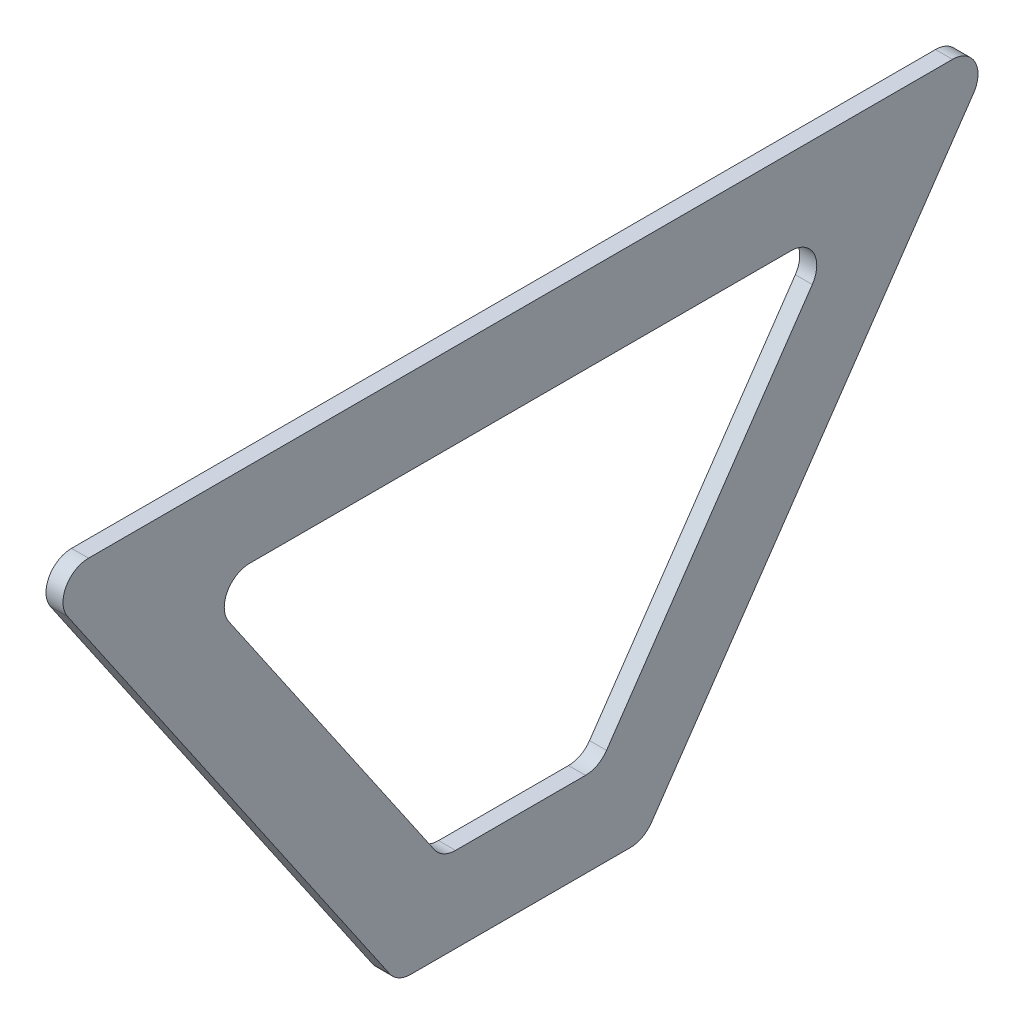
ISO-10303-21;
HEADER;
FILE_DESCRIPTION(('STEP AP214'),'2;1');
FILE_NAME('part.step','',(''),(''),'','','');
FILE_SCHEMA(('AUTOMOTIVE_DESIGN { 1 0 10303 214 1 1 1 1 }'));
ENDSEC;
DATA;
#1=APPLICATION_CONTEXT('core data for automotive mechanical design processes');
#2=APPLICATION_PROTOCOL_DEFINITION('international standard','automotive_design',2000,#1);
#3=PRODUCT_CONTEXT('',#1,'mechanical');
#4=PRODUCT('Part','Part','',(#3));
#5=PRODUCT_RELATED_PRODUCT_CATEGORY('part','',(#4));
#6=PRODUCT_DEFINITION_FORMATION('','',#4);
#7=PRODUCT_DEFINITION_CONTEXT('part definition',#1,'design');
#8=PRODUCT_DEFINITION('design','',#6,#7);
#9=PRODUCT_DEFINITION_SHAPE('','',#8);
#10=(LENGTH_UNIT() NAMED_UNIT(*) SI_UNIT(.MILLI.,.METRE.));
#11=(NAMED_UNIT(*) PLANE_ANGLE_UNIT() SI_UNIT($,.RADIAN.));
#12=(NAMED_UNIT(*) SI_UNIT($,.STERADIAN.) SOLID_ANGLE_UNIT());
#13=UNCERTAINTY_MEASURE_WITH_UNIT(LENGTH_MEASURE(1.E-05),#10,'distance_accuracy_value','');
#14=(GEOMETRIC_REPRESENTATION_CONTEXT(3) GLOBAL_UNCERTAINTY_ASSIGNED_CONTEXT((#13)) GLOBAL_UNIT_ASSIGNED_CONTEXT((#10,
#11,#12)) REPRESENTATION_CONTEXT('',''));
#15=CARTESIAN_POINT('',(0.,0.,0.));
#16=DIRECTION('',(0.,0.,1.));
#17=DIRECTION('',(1.,0.,0.));
#18=AXIS2_PLACEMENT_3D('',#15,#16,#17);
#19=CARTESIAN_POINT('',(-2.,-22.0258620689655,-14.5));
#20=DIRECTION('',(0.,-0.564897269685444,-0.825161241638221));
#21=DIRECTION('',(0.,0.825161241638221,-0.564897269685444));
#22=AXIS2_PLACEMENT_3D('',#19,#20,#21);
#23=PLANE('',#22);
#24=DIRECTION('',(0.,0.825161241638221,-0.564897269685444));
#25=VECTOR('',#24,1.);
#26=CARTESIAN_POINT('',(0.,-22.0258620689655,-14.5));
#27=LINE('',#26,#25);
#28=CARTESIAN_POINT('',(0.,-20.7205538780219,-15.3936011484231));
#29=VERTEX_POINT('',#28);
#30=CARTESIAN_POINT('',(0.,34.6300208346218,-53.2860601648165));
#31=VERTEX_POINT('',#30);
#32=EDGE_CURVE('E209',#29,#31,#27,.T.);
#33=ORIENTED_EDGE('',*,*,#32,.F.);
#34=DIRECTION('',(1.,0.,0.));
#35=VECTOR('',#34,1.);
#36=CARTESIAN_POINT('',(-2.,-20.7205538780219,-15.3936011484231));
#37=LINE('',#36,#35);
#38=CARTESIAN_POINT('',(-2.,-20.7205538780219,-15.3936011484231));
#39=VERTEX_POINT('',#38);
#40=EDGE_CURVE('E263',#29,#39,#37,.F.);
#41=ORIENTED_EDGE('',*,*,#40,.T.);
#42=DIRECTION('',(0.,0.825161241638221,-0.564897269685444));
#43=VECTOR('',#42,1.);
#44=CARTESIAN_POINT('',(-2.,-22.0258620689655,-14.5));
#45=LINE('',#44,#43);
#46=CARTESIAN_POINT('',(-2.,34.6300208346218,-53.2860601648165));
#47=VERTEX_POINT('',#46);
#48=EDGE_CURVE('E197',#39,#47,#45,.T.);
#49=ORIENTED_EDGE('',*,*,#48,.T.);
#50=DIRECTION('',(1.,0.,0.));
#51=VECTOR('',#50,1.);
#52=CARTESIAN_POINT('',(-2.,34.6300208346218,-53.2860601648165));
#53=LINE('',#52,#51);
#54=EDGE_CURVE('E260',#47,#31,#53,.T.);
#55=ORIENTED_EDGE('',*,*,#54,.T.);
#56=EDGE_LOOP('',(#33,#41,#49,#55));
#57=FACE_BOUND('',#56,.T.);
#58=ADVANCED_FACE('F44',(#57),#23,.T.);
#59=CARTESIAN_POINT('',(-2.,-22.0258620689655,14.5));
#60=DIRECTION('',(0.,-1.,0.));
#61=DIRECTION('',(0.,0.,-1.));
#62=AXIS2_PLACEMENT_3D('',#59,#60,#61);
#63=PLANE('',#62);
#64=DIRECTION('',(0.,0.,-1.));
#65=VECTOR('',#64,1.);
#66=CARTESIAN_POINT('',(0.,-22.0258620689655,14.5));
#67=LINE('',#66,#65);
#68=CARTESIAN_POINT('',(0.,-22.0258620689655,12.9181174235084));
#69=VERTEX_POINT('',#68);
#70=CARTESIAN_POINT('',(0.,-22.0258620689655,-12.9181174235084));
#71=VERTEX_POINT('',#70);
#72=EDGE_CURVE('E201',#69,#71,#67,.T.);
#73=ORIENTED_EDGE('',*,*,#72,.F.);
#74=DIRECTION('',(1.,0.,0.));
#75=VECTOR('',#74,1.);
#76=CARTESIAN_POINT('',(-2.,-22.0258620689655,12.9181174235084));
#77=LINE('',#76,#75);
#78=CARTESIAN_POINT('',(-2.,-22.0258620689655,12.9181174235084));
#79=VERTEX_POINT('',#78);
#80=EDGE_CURVE('E251',#69,#79,#77,.F.);
#81=ORIENTED_EDGE('',*,*,#80,.T.);
#82=DIRECTION('',(0.,0.,-1.));
#83=VECTOR('',#82,1.);
#84=CARTESIAN_POINT('',(-2.,-22.0258620689655,14.5));
#85=LINE('',#84,#83);
#86=CARTESIAN_POINT('',(-2.,-22.0258620689655,-12.9181174235084));
#87=VERTEX_POINT('',#86);
#88=EDGE_CURVE('E206',#79,#87,#85,.T.);
#89=ORIENTED_EDGE('',*,*,#88,.T.);
#90=DIRECTION('',(1.,0.,0.));
#91=VECTOR('',#90,1.);
#92=CARTESIAN_POINT('',(-2.,-22.0258620689655,-12.9181174235084));
#93=LINE('',#92,#91);
#94=EDGE_CURVE('E248',#87,#71,#93,.T.);
#95=ORIENTED_EDGE('',*,*,#94,.T.);
#96=EDGE_LOOP('',(#73,#81,#89,#95));
#97=FACE_BOUND('',#96,.T.);
#98=ADVANCED_FACE('F318',(#97),#63,.T.);
#99=CARTESIAN_POINT('',(-2.,-22.0258620689655,14.5));
#100=DIRECTION('',(0.,-0.564897269685444,0.825161241638221));
#101=DIRECTION('',(0.,-0.825161241638221,-0.564897269685444));
#102=AXIS2_PLACEMENT_3D('',#99,#100,#101);
#103=PLANE('',#102);
#104=DIRECTION('',(0.,-0.825161241638221,-0.564897269685444));
#105=VECTOR('',#104,1.);
#106=CARTESIAN_POINT('',(-2.,-22.0258620689655,14.5));
#107=LINE('',#106,#105);
#108=CARTESIAN_POINT('',(-2.,34.6300208346218,53.2860601648165));
#109=VERTEX_POINT('',#108);
#110=CARTESIAN_POINT('',(-2.,-20.7205538780219,15.3936011484231));
#111=VERTEX_POINT('',#110);
#112=EDGE_CURVE('E203',#109,#111,#107,.T.);
#113=ORIENTED_EDGE('',*,*,#112,.T.);
#114=DIRECTION('',(1.,0.,0.));
#115=VECTOR('',#114,1.);
#116=CARTESIAN_POINT('',(-2.,-20.7205538780219,15.3936011484231));
#117=LINE('',#116,#115);
#118=CARTESIAN_POINT('',(0.,-20.7205538780219,15.3936011484231));
#119=VERTEX_POINT('',#118);
#120=EDGE_CURVE('E237',#111,#119,#117,.T.);
#121=ORIENTED_EDGE('',*,*,#120,.T.);
#122=DIRECTION('',(0.,-0.825161241638221,-0.564897269685444));
#123=VECTOR('',#122,1.);
#124=CARTESIAN_POINT('',(0.,-22.0258620689655,14.5));
#125=LINE('',#124,#123);
#126=CARTESIAN_POINT('',(0.,34.6300208346218,53.2860601648165));
#127=VERTEX_POINT('',#126);
#128=EDGE_CURVE('E216',#127,#119,#125,.T.);
#129=ORIENTED_EDGE('',*,*,#128,.F.);
#130=DIRECTION('',(1.,0.,0.));
#131=VECTOR('',#130,1.);
#132=CARTESIAN_POINT('',(-2.,34.6300208346218,53.2860601648165));
#133=LINE('',#132,#131);
#134=EDGE_CURVE('E235',#127,#109,#133,.F.);
#135=ORIENTED_EDGE('',*,*,#134,.T.);
#136=EDGE_LOOP('',(#113,#121,#129,#135));
#137=FACE_BOUND('',#136,.T.);
#138=ADVANCED_FACE('F324',(#137),#103,.T.);
#139=CARTESIAN_POINT('',(-2.,39.3247126436782,-56.5));
#140=DIRECTION('',(0.,1.,0.));
#141=DIRECTION('',(0.,0.,1.));
#142=AXIS2_PLACEMENT_3D('',#139,#140,#141);
#143=PLANE('',#142);
#144=DIRECTION('',(0.,0.,1.));
#145=VECTOR('',#144,1.);
#146=CARTESIAN_POINT('',(0.,39.3247126436782,-56.5));
#147=LINE('',#146,#145);
#148=CARTESIAN_POINT('',(0.,39.3247126436782,-50.8105764399019));
#149=VERTEX_POINT('',#148);
#150=CARTESIAN_POINT('',(0.,39.3247126436781,50.8105764399019));
#151=VERTEX_POINT('',#150);
#152=EDGE_CURVE('E212',#149,#151,#147,.T.);
#153=ORIENTED_EDGE('',*,*,#152,.F.);
#154=DIRECTION('',(1.,0.,0.));
#155=VECTOR('',#154,1.);
#156=CARTESIAN_POINT('',(-2.,39.3247126436782,-50.8105764399019));
#157=LINE('',#156,#155);
#158=CARTESIAN_POINT('',(-2.,39.3247126436782,-50.8105764399019));
#159=VERTEX_POINT('',#158);
#160=EDGE_CURVE('E66',#149,#159,#157,.F.);
#161=ORIENTED_EDGE('',*,*,#160,.T.);
#162=DIRECTION('',(0.,0.,1.));
#163=VECTOR('',#162,1.);
#164=CARTESIAN_POINT('',(-2.,39.3247126436782,-56.5));
#165=LINE('',#164,#163);
#166=CARTESIAN_POINT('',(-2.,39.3247126436781,50.8105764399019));
#167=VERTEX_POINT('',#166);
#168=EDGE_CURVE('E200',#159,#167,#165,.T.);
#169=ORIENTED_EDGE('',*,*,#168,.T.);
#170=DIRECTION('',(1.,0.,0.));
#171=VECTOR('',#170,1.);
#172=CARTESIAN_POINT('',(-2.,39.3247126436781,50.8105764399019));
#173=LINE('',#172,#171);
#174=EDGE_CURVE('E265',#167,#151,#173,.T.);
#175=ORIENTED_EDGE('',*,*,#174,.T.);
#176=EDGE_LOOP('',(#153,#161,#169,#175));
#177=FACE_BOUND('',#176,.T.);
#178=ADVANCED_FACE('F330',(#177),#143,.T.);
#179=CARTESIAN_POINT('',(-2.,0.,0.));
#180=DIRECTION('',(1.,0.,0.));
#181=DIRECTION('',(0.,0.,-1.));
#182=AXIS2_PLACEMENT_3D('',#179,#180,#181);
#183=PLANE('',#182);
#184=DIRECTION('',(0.,-0.825161241638221,-0.564897269685445));
#185=VECTOR('',#184,1.);
#186=CARTESIAN_POINT('',(-2.,-12.0258620689655,9.22705807836136));
#187=LINE('',#186,#185);
#188=CARTESIAN_POINT('',(-2.,24.6300208346218,34.3213149644894));
#189=VERTEX_POINT('',#188);
#190=CARTESIAN_POINT('',(-2.,-10.7205538780219,10.1206592267844));
#191=VERTEX_POINT('',#190);
#192=EDGE_CURVE('E292',#189,#191,#187,.T.);
#193=ORIENTED_EDGE('',*,*,#192,.T.);
#194=CARTESIAN_POINT('',(-2.,-9.02586206896553,7.64517550186977));
#195=DIRECTION('',(1.,0.,0.));
#196=DIRECTION('',(0.,0.,-1.));
#197=AXIS2_PLACEMENT_3D('',#194,#195,#196);
#198=CIRCLE('',#197,3.);
#199=CARTESIAN_POINT('',(-2.,-12.0258620689655,7.64517550186977));
#200=VERTEX_POINT('',#199);
#201=EDGE_CURVE('E11',#191,#200,#198,.T.);
#202=ORIENTED_EDGE('',*,*,#201,.T.);
#203=DIRECTION('',(0.,0.,-1.));
#204=VECTOR('',#203,1.);
#205=CARTESIAN_POINT('',(-2.,-12.0258620689655,9.22705807836136));
#206=LINE('',#205,#204);
#207=CARTESIAN_POINT('',(-2.,-12.0258620689655,-7.64517550186979));
#208=VERTEX_POINT('',#207);
#209=EDGE_CURVE('E213',#200,#208,#206,.T.);
#210=ORIENTED_EDGE('',*,*,#209,.T.);
#211=CARTESIAN_POINT('',(-2.,-9.02586206896553,-7.64517550186978));
#212=DIRECTION('',(1.,0.,0.));
#213=DIRECTION('',(0.,0.,-1.));
#214=AXIS2_PLACEMENT_3D('',#211,#212,#213);
#215=CIRCLE('',#214,3.);
#216=CARTESIAN_POINT('',(-2.,-10.7205538780219,-10.1206592267844));
#217=VERTEX_POINT('',#216);
#218=EDGE_CURVE('E275',#208,#217,#215,.T.);
#219=ORIENTED_EDGE('',*,*,#218,.T.);
#220=DIRECTION('',(0.,0.825161241638221,-0.564897269685444));
#221=VECTOR('',#220,1.);
#222=CARTESIAN_POINT('',(-2.,-12.0258620689655,-9.22705807836137));
#223=LINE('',#222,#221);
#224=CARTESIAN_POINT('',(-2.,24.6300208346218,-34.3213149644894));
#225=VERTEX_POINT('',#224);
#226=EDGE_CURVE('E196',#217,#225,#223,.T.);
#227=ORIENTED_EDGE('',*,*,#226,.T.);
#228=CARTESIAN_POINT('',(-2.,26.3247126436782,-31.8458312395747));
#229=DIRECTION('',(1.,0.,0.));
#230=DIRECTION('',(0.,0.,-1.));
#231=AXIS2_PLACEMENT_3D('',#228,#229,#230);
#232=CIRCLE('',#231,3.);
#233=CARTESIAN_POINT('',(-2.,29.3247126436782,-31.8458312395747));
#234=VERTEX_POINT('',#233);
#235=EDGE_CURVE('E168',#225,#234,#232,.T.);
#236=ORIENTED_EDGE('',*,*,#235,.T.);
#237=DIRECTION('',(0.,0.,1.));
#238=VECTOR('',#237,1.);
#239=CARTESIAN_POINT('',(-2.,29.3247126436782,-37.5352547996729));
#240=LINE('',#239,#238);
#241=CARTESIAN_POINT('',(-2.,29.3247126436781,31.8458312395747));
#242=VERTEX_POINT('',#241);
#243=EDGE_CURVE('E177',#234,#242,#240,.T.);
#244=ORIENTED_EDGE('',*,*,#243,.T.);
#245=CARTESIAN_POINT('',(-2.,26.3247126436781,31.8458312395747));
#246=DIRECTION('',(1.,0.,0.));
#247=DIRECTION('',(0.,0.,-1.));
#248=AXIS2_PLACEMENT_3D('',#245,#246,#247);
#249=CIRCLE('',#248,3.);
#250=EDGE_CURVE('E271',#242,#189,#249,.T.);
#251=ORIENTED_EDGE('',*,*,#250,.T.);
#252=EDGE_LOOP('',(#193,#202,#210,#219,#227,#236,#244,#251));
#253=FACE_BOUND('',#252,.T.);
#254=ORIENTED_EDGE('',*,*,#88,.F.);
#255=CARTESIAN_POINT('',(-2.,-19.0258620689655,12.9181174235084));
#256=DIRECTION('',(1.,0.,0.));
#257=DIRECTION('',(0.,0.,-1.));
#258=AXIS2_PLACEMENT_3D('',#255,#256,#257);
#259=CIRCLE('',#258,3.);
#260=EDGE_CURVE('E258',#79,#111,#259,.F.);
#261=ORIENTED_EDGE('',*,*,#260,.T.);
#262=ORIENTED_EDGE('',*,*,#112,.F.);
#263=CARTESIAN_POINT('',(-2.,36.3247126436781,50.8105764399019));
#264=DIRECTION('',(1.,0.,0.));
#265=DIRECTION('',(0.,0.,-1.));
#266=AXIS2_PLACEMENT_3D('',#263,#264,#265);
#267=CIRCLE('',#266,3.);
#268=EDGE_CURVE('E59',#109,#167,#267,.F.);
#269=ORIENTED_EDGE('',*,*,#268,.T.);
#270=ORIENTED_EDGE('',*,*,#168,.F.);
#271=CARTESIAN_POINT('',(-2.,36.3247126436782,-50.8105764399019));
#272=DIRECTION('',(1.,0.,0.));
#273=DIRECTION('',(0.,0.,-1.));
#274=AXIS2_PLACEMENT_3D('',#271,#272,#273);
#275=CIRCLE('',#274,3.);
#276=EDGE_CURVE('E254',#159,#47,#275,.F.);
#277=ORIENTED_EDGE('',*,*,#276,.T.);
#278=ORIENTED_EDGE('',*,*,#48,.F.);
#279=CARTESIAN_POINT('',(-2.,-19.0258620689655,-12.9181174235084));
#280=DIRECTION('',(1.,0.,0.));
#281=DIRECTION('',(0.,0.,-1.));
#282=AXIS2_PLACEMENT_3D('',#279,#280,#281);
#283=CIRCLE('',#282,3.);
#284=EDGE_CURVE('E256',#39,#87,#283,.F.);
#285=ORIENTED_EDGE('',*,*,#284,.T.);
#286=EDGE_LOOP('',(#254,#261,#262,#269,#270,#277,#278,#285));
#287=FACE_BOUND('',#286,.T.);
#288=ADVANCED_FACE('F290',(#253,#287),#183,.F.);
#289=CARTESIAN_POINT('',(0.,0.,0.));
#290=DIRECTION('',(1.,0.,0.));
#291=DIRECTION('',(0.,0.,-1.));
#292=AXIS2_PLACEMENT_3D('',#289,#290,#291);
#293=PLANE('',#292);
#294=DIRECTION('',(0.,0.825161241638221,-0.564897269685444));
#295=VECTOR('',#294,1.);
#296=CARTESIAN_POINT('',(0.,-12.0258620689655,-9.22705807836137));
#297=LINE('',#296,#295);
#298=CARTESIAN_POINT('',(0.,-10.7205538780219,-10.1206592267844));
#299=VERTEX_POINT('',#298);
#300=CARTESIAN_POINT('',(0.,24.6300208346218,-34.3213149644894));
#301=VERTEX_POINT('',#300);
#302=EDGE_CURVE('E186',#299,#301,#297,.T.);
#303=ORIENTED_EDGE('',*,*,#302,.F.);
#304=CARTESIAN_POINT('',(0.,-9.02586206896553,-7.64517550186978));
#305=DIRECTION('',(1.,0.,0.));
#306=DIRECTION('',(0.,0.,-1.));
#307=AXIS2_PLACEMENT_3D('',#304,#305,#306);
#308=CIRCLE('',#307,3.);
#309=CARTESIAN_POINT('',(0.,-12.0258620689655,-7.64517550186979));
#310=VERTEX_POINT('',#309);
#311=EDGE_CURVE('E273',#299,#310,#308,.F.);
#312=ORIENTED_EDGE('',*,*,#311,.T.);
#313=DIRECTION('',(0.,0.,-1.));
#314=VECTOR('',#313,1.);
#315=CARTESIAN_POINT('',(0.,-12.0258620689655,9.22705807836136));
#316=LINE('',#315,#314);
#317=CARTESIAN_POINT('',(0.,-12.0258620689655,7.64517550186977));
#318=VERTEX_POINT('',#317);
#319=EDGE_CURVE('E189',#318,#310,#316,.T.);
#320=ORIENTED_EDGE('',*,*,#319,.F.);
#321=CARTESIAN_POINT('',(0.,-9.02586206896553,7.64517550186977));
#322=DIRECTION('',(1.,0.,0.));
#323=DIRECTION('',(0.,0.,-1.));
#324=AXIS2_PLACEMENT_3D('',#321,#322,#323);
#325=CIRCLE('',#324,3.);
#326=CARTESIAN_POINT('',(0.,-10.7205538780219,10.1206592267844));
#327=VERTEX_POINT('',#326);
#328=EDGE_CURVE('E52',#318,#327,#325,.F.);
#329=ORIENTED_EDGE('',*,*,#328,.T.);
#330=DIRECTION('',(0.,-0.825161241638221,-0.564897269685445));
#331=VECTOR('',#330,1.);
#332=CARTESIAN_POINT('',(0.,-12.0258620689655,9.22705807836136));
#333=LINE('',#332,#331);
#334=CARTESIAN_POINT('',(0.,24.6300208346218,34.3213149644894));
#335=VERTEX_POINT('',#334);
#336=EDGE_CURVE('E185',#335,#327,#333,.T.);
#337=ORIENTED_EDGE('',*,*,#336,.F.);
#338=CARTESIAN_POINT('',(0.,26.3247126436781,31.8458312395747));
#339=DIRECTION('',(1.,0.,0.));
#340=DIRECTION('',(0.,0.,-1.));
#341=AXIS2_PLACEMENT_3D('',#338,#339,#340);
#342=CIRCLE('',#341,3.);
#343=CARTESIAN_POINT('',(0.,29.3247126436781,31.8458312395747));
#344=VERTEX_POINT('',#343);
#345=EDGE_CURVE('E184',#335,#344,#342,.F.);
#346=ORIENTED_EDGE('',*,*,#345,.T.);
#347=DIRECTION('',(0.,0.,1.));
#348=VECTOR('',#347,1.);
#349=CARTESIAN_POINT('',(0.,29.3247126436782,-37.5352547996729));
#350=LINE('',#349,#348);
#351=CARTESIAN_POINT('',(0.,29.3247126436782,-31.8458312395747));
#352=VERTEX_POINT('',#351);
#353=EDGE_CURVE('E174',#352,#344,#350,.T.);
#354=ORIENTED_EDGE('',*,*,#353,.F.);
#355=CARTESIAN_POINT('',(0.,26.3247126436782,-31.8458312395747));
#356=DIRECTION('',(1.,0.,0.));
#357=DIRECTION('',(0.,0.,-1.));
#358=AXIS2_PLACEMENT_3D('',#355,#356,#357);
#359=CIRCLE('',#358,3.);
#360=EDGE_CURVE('E158',#352,#301,#359,.F.);
#361=ORIENTED_EDGE('',*,*,#360,.T.);
#362=EDGE_LOOP('',(#303,#312,#320,#329,#337,#346,#354,#361));
#363=FACE_BOUND('',#362,.T.);
#364=ORIENTED_EDGE('',*,*,#128,.T.);
#365=CARTESIAN_POINT('',(0.,-19.0258620689655,12.9181174235084));
#366=DIRECTION('',(1.,0.,0.));
#367=DIRECTION('',(0.,0.,-1.));
#368=AXIS2_PLACEMENT_3D('',#365,#366,#367);
#369=CIRCLE('',#368,3.);
#370=EDGE_CURVE('E246',#119,#69,#369,.T.);
#371=ORIENTED_EDGE('',*,*,#370,.T.);
#372=ORIENTED_EDGE('',*,*,#72,.T.);
#373=CARTESIAN_POINT('',(0.,-19.0258620689655,-12.9181174235084));
#374=DIRECTION('',(1.,0.,0.));
#375=DIRECTION('',(0.,0.,-1.));
#376=AXIS2_PLACEMENT_3D('',#373,#374,#375);
#377=CIRCLE('',#376,3.);
#378=EDGE_CURVE('E244',#71,#29,#377,.T.);
#379=ORIENTED_EDGE('',*,*,#378,.T.);
#380=ORIENTED_EDGE('',*,*,#32,.T.);
#381=CARTESIAN_POINT('',(0.,36.3247126436782,-50.8105764399019));
#382=DIRECTION('',(1.,0.,0.));
#383=DIRECTION('',(0.,0.,-1.));
#384=AXIS2_PLACEMENT_3D('',#381,#382,#383);
#385=CIRCLE('',#384,3.);
#386=EDGE_CURVE('E242',#31,#149,#385,.T.);
#387=ORIENTED_EDGE('',*,*,#386,.T.);
#388=ORIENTED_EDGE('',*,*,#152,.T.);
#389=CARTESIAN_POINT('',(0.,36.3247126436781,50.8105764399019));
#390=DIRECTION('',(1.,0.,0.));
#391=DIRECTION('',(0.,0.,-1.));
#392=AXIS2_PLACEMENT_3D('',#389,#390,#391);
#393=CIRCLE('',#392,3.);
#394=EDGE_CURVE('E240',#151,#127,#393,.T.);
#395=ORIENTED_EDGE('',*,*,#394,.T.);
#396=EDGE_LOOP('',(#364,#371,#372,#379,#380,#387,#388,#395));
#397=FACE_BOUND('',#396,.T.);
#398=ADVANCED_FACE('F181',(#363,#397),#293,.T.);
#399=CARTESIAN_POINT('',(-2.,-12.0258620689655,-9.22705807836137));
#400=DIRECTION('',(0.,-0.564897269685444,-0.825161241638221));
#401=DIRECTION('',(0.,0.825161241638221,-0.564897269685444));
#402=AXIS2_PLACEMENT_3D('',#399,#400,#401);
#403=PLANE('',#402);
#404=ORIENTED_EDGE('',*,*,#302,.T.);
#405=DIRECTION('',(1.,0.,0.));
#406=VECTOR('',#405,1.);
#407=CARTESIAN_POINT('',(-2.,24.6300208346218,-34.3213149644894));
#408=LINE('',#407,#406);
#409=EDGE_CURVE('E163',#301,#225,#408,.F.);
#410=ORIENTED_EDGE('',*,*,#409,.T.);
#411=ORIENTED_EDGE('',*,*,#226,.F.);
#412=DIRECTION('',(1.,0.,0.));
#413=VECTOR('',#412,1.);
#414=CARTESIAN_POINT('',(0.,-10.7205538780219,-10.1206592267844));
#415=LINE('',#414,#413);
#416=EDGE_CURVE('E178',#217,#299,#415,.T.);
#417=ORIENTED_EDGE('',*,*,#416,.T.);
#418=EDGE_LOOP('',(#404,#410,#411,#417));
#419=FACE_BOUND('',#418,.T.);
#420=ADVANCED_FACE('F303',(#419),#403,.F.);
#421=CARTESIAN_POINT('',(-2.,-12.0258620689655,9.22705807836136));
#422=DIRECTION('',(0.,-1.,0.));
#423=DIRECTION('',(0.,0.,-1.));
#424=AXIS2_PLACEMENT_3D('',#421,#422,#423);
#425=PLANE('',#424);
#426=ORIENTED_EDGE('',*,*,#319,.T.);
#427=DIRECTION('',(1.,0.,0.));
#428=VECTOR('',#427,1.);
#429=CARTESIAN_POINT('',(-2.,-12.0258620689655,-7.64517550186978));
#430=LINE('',#429,#428);
#431=EDGE_CURVE('E233',#310,#208,#430,.F.);
#432=ORIENTED_EDGE('',*,*,#431,.T.);
#433=ORIENTED_EDGE('',*,*,#209,.F.);
#434=DIRECTION('',(1.,0.,0.));
#435=VECTOR('',#434,1.);
#436=CARTESIAN_POINT('',(0.,-12.0258620689655,7.64517550186977));
#437=LINE('',#436,#435);
#438=EDGE_CURVE('E230',#200,#318,#437,.T.);
#439=ORIENTED_EDGE('',*,*,#438,.T.);
#440=EDGE_LOOP('',(#426,#432,#433,#439));
#441=FACE_BOUND('',#440,.T.);
#442=ADVANCED_FACE('F294',(#441),#425,.F.);
#443=CARTESIAN_POINT('',(-2.,-12.0258620689655,9.22705807836136));
#444=DIRECTION('',(0.,-0.564897269685445,0.825161241638221));
#445=DIRECTION('',(0.,-0.825161241638221,-0.564897269685445));
#446=AXIS2_PLACEMENT_3D('',#443,#444,#445);
#447=PLANE('',#446);
#448=ORIENTED_EDGE('',*,*,#192,.F.);
#449=DIRECTION('',(1.,0.,0.));
#450=VECTOR('',#449,1.);
#451=CARTESIAN_POINT('',(0.,24.6300208346218,34.3213149644894));
#452=LINE('',#451,#450);
#453=EDGE_CURVE('E227',#189,#335,#452,.T.);
#454=ORIENTED_EDGE('',*,*,#453,.T.);
#455=ORIENTED_EDGE('',*,*,#336,.T.);
#456=DIRECTION('',(1.,0.,0.));
#457=VECTOR('',#456,1.);
#458=CARTESIAN_POINT('',(-2.,-10.7205538780219,10.1206592267844));
#459=LINE('',#458,#457);
#460=EDGE_CURVE('E225',#327,#191,#459,.F.);
#461=ORIENTED_EDGE('',*,*,#460,.T.);
#462=EDGE_LOOP('',(#448,#454,#455,#461));
#463=FACE_BOUND('',#462,.T.);
#464=ADVANCED_FACE('F282',(#463),#447,.F.);
#465=CARTESIAN_POINT('',(-2.,29.3247126436782,-37.5352547996729));
#466=DIRECTION('',(0.,1.,0.));
#467=DIRECTION('',(0.,0.,1.));
#468=AXIS2_PLACEMENT_3D('',#465,#466,#467);
#469=PLANE('',#468);
#470=ORIENTED_EDGE('',*,*,#243,.F.);
#471=DIRECTION('',(1.,0.,0.));
#472=VECTOR('',#471,1.);
#473=CARTESIAN_POINT('',(0.,29.3247126436782,-31.8458312395747));
#474=LINE('',#473,#472);
#475=EDGE_CURVE('E162',#234,#352,#474,.T.);
#476=ORIENTED_EDGE('',*,*,#475,.T.);
#477=ORIENTED_EDGE('',*,*,#353,.T.);
#478=DIRECTION('',(1.,0.,0.));
#479=VECTOR('',#478,1.);
#480=CARTESIAN_POINT('',(-2.,29.3247126436781,31.8458312395747));
#481=LINE('',#480,#479);
#482=EDGE_CURVE('E179',#344,#242,#481,.F.);
#483=ORIENTED_EDGE('',*,*,#482,.T.);
#484=EDGE_LOOP('',(#470,#476,#477,#483));
#485=FACE_BOUND('',#484,.T.);
#486=ADVANCED_FACE('F173',(#485),#469,.F.);
#487=CARTESIAN_POINT('',(-2.,26.3247126436782,-31.8458312395747));
#488=DIRECTION('',(-1.,0.,0.));
#489=DIRECTION('',(0.,0.,1.));
#490=AXIS2_PLACEMENT_3D('',#487,#488,#489);
#491=CYLINDRICAL_SURFACE('',#490,3.);
#492=ORIENTED_EDGE('',*,*,#235,.F.);
#493=ORIENTED_EDGE('',*,*,#409,.F.);
#494=ORIENTED_EDGE('',*,*,#360,.F.);
#495=ORIENTED_EDGE('',*,*,#475,.F.);
#496=EDGE_LOOP('',(#492,#493,#494,#495));
#497=FACE_BOUND('',#496,.T.);
#498=ADVANCED_FACE('F161',(#497),#491,.F.);
#499=CARTESIAN_POINT('',(-2.,26.3247126436781,31.8458312395747));
#500=DIRECTION('',(-1.,0.,0.));
#501=DIRECTION('',(0.,0.,1.));
#502=AXIS2_PLACEMENT_3D('',#499,#500,#501);
#503=CYLINDRICAL_SURFACE('',#502,3.);
#504=ORIENTED_EDGE('',*,*,#250,.F.);
#505=ORIENTED_EDGE('',*,*,#482,.F.);
#506=ORIENTED_EDGE('',*,*,#345,.F.);
#507=ORIENTED_EDGE('',*,*,#453,.F.);
#508=EDGE_LOOP('',(#504,#505,#506,#507));
#509=FACE_BOUND('',#508,.T.);
#510=ADVANCED_FACE('F307',(#509),#503,.F.);
#511=CARTESIAN_POINT('',(-2.,-9.02586206896553,-7.64517550186978));
#512=DIRECTION('',(-1.,0.,0.));
#513=DIRECTION('',(0.,0.,1.));
#514=AXIS2_PLACEMENT_3D('',#511,#512,#513);
#515=CYLINDRICAL_SURFACE('',#514,3.);
#516=ORIENTED_EDGE('',*,*,#218,.F.);
#517=ORIENTED_EDGE('',*,*,#431,.F.);
#518=ORIENTED_EDGE('',*,*,#311,.F.);
#519=ORIENTED_EDGE('',*,*,#416,.F.);
#520=EDGE_LOOP('',(#516,#517,#518,#519));
#521=FACE_BOUND('',#520,.T.);
#522=ADVANCED_FACE('F305',(#521),#515,.F.);
#523=CARTESIAN_POINT('',(-2.,-9.02586206896553,7.64517550186977));
#524=DIRECTION('',(-1.,0.,0.));
#525=DIRECTION('',(0.,0.,1.));
#526=AXIS2_PLACEMENT_3D('',#523,#524,#525);
#527=CYLINDRICAL_SURFACE('',#526,3.);
#528=ORIENTED_EDGE('',*,*,#201,.F.);
#529=ORIENTED_EDGE('',*,*,#460,.F.);
#530=ORIENTED_EDGE('',*,*,#328,.F.);
#531=ORIENTED_EDGE('',*,*,#438,.F.);
#532=EDGE_LOOP('',(#528,#529,#530,#531));
#533=FACE_BOUND('',#532,.T.);
#534=ADVANCED_FACE('F286',(#533),#527,.F.);
#535=CARTESIAN_POINT('',(-2.,-19.0258620689655,12.9181174235084));
#536=DIRECTION('',(1.,0.,0.));
#537=DIRECTION('',(0.,0.,-1.));
#538=AXIS2_PLACEMENT_3D('',#535,#536,#537);
#539=CYLINDRICAL_SURFACE('',#538,3.);
#540=ORIENTED_EDGE('',*,*,#260,.F.);
#541=ORIENTED_EDGE('',*,*,#80,.F.);
#542=ORIENTED_EDGE('',*,*,#370,.F.);
#543=ORIENTED_EDGE('',*,*,#120,.F.);
#544=EDGE_LOOP('',(#540,#541,#542,#543));
#545=FACE_BOUND('',#544,.T.);
#546=ADVANCED_FACE('F313',(#545),#539,.T.);
#547=CARTESIAN_POINT('',(-2.,-19.0258620689655,-12.9181174235084));
#548=DIRECTION('',(1.,0.,0.));
#549=DIRECTION('',(0.,0.,-1.));
#550=AXIS2_PLACEMENT_3D('',#547,#548,#549);
#551=CYLINDRICAL_SURFACE('',#550,3.);
#552=ORIENTED_EDGE('',*,*,#284,.F.);
#553=ORIENTED_EDGE('',*,*,#40,.F.);
#554=ORIENTED_EDGE('',*,*,#378,.F.);
#555=ORIENTED_EDGE('',*,*,#94,.F.);
#556=EDGE_LOOP('',(#552,#553,#554,#555));
#557=FACE_BOUND('',#556,.T.);
#558=ADVANCED_FACE('F364',(#557),#551,.T.);
#559=CARTESIAN_POINT('',(-2.,36.3247126436782,-50.8105764399019));
#560=DIRECTION('',(1.,0.,0.));
#561=DIRECTION('',(0.,0.,-1.));
#562=AXIS2_PLACEMENT_3D('',#559,#560,#561);
#563=CYLINDRICAL_SURFACE('',#562,3.);
#564=ORIENTED_EDGE('',*,*,#276,.F.);
#565=ORIENTED_EDGE('',*,*,#160,.F.);
#566=ORIENTED_EDGE('',*,*,#386,.F.);
#567=ORIENTED_EDGE('',*,*,#54,.F.);
#568=EDGE_LOOP('',(#564,#565,#566,#567));
#569=FACE_BOUND('',#568,.T.);
#570=ADVANCED_FACE('F370',(#569),#563,.T.);
#571=CARTESIAN_POINT('',(-2.,36.3247126436781,50.8105764399019));
#572=DIRECTION('',(1.,0.,0.));
#573=DIRECTION('',(0.,0.,-1.));
#574=AXIS2_PLACEMENT_3D('',#571,#572,#573);
#575=CYLINDRICAL_SURFACE('',#574,3.);
#576=ORIENTED_EDGE('',*,*,#268,.F.);
#577=ORIENTED_EDGE('',*,*,#134,.F.);
#578=ORIENTED_EDGE('',*,*,#394,.F.);
#579=ORIENTED_EDGE('',*,*,#174,.F.);
#580=EDGE_LOOP('',(#576,#577,#578,#579));
#581=FACE_BOUND('',#580,.T.);
#582=ADVANCED_FACE('F46',(#581),#575,.T.);
#583=CLOSED_SHELL('',(#58,#98,#138,#178,#288,#398,#420,#442,#464,#486,#498,#510,#522,#534,#546,
#558,#570,#582));
#584=MANIFOLD_SOLID_BREP('B2',#583);
#585=ADVANCED_BREP_SHAPE_REPRESENTATION('',(#18,#584),#14);
#586=SHAPE_DEFINITION_REPRESENTATION(#9,#585);
ENDSEC;
END-ISO-10303-21;
